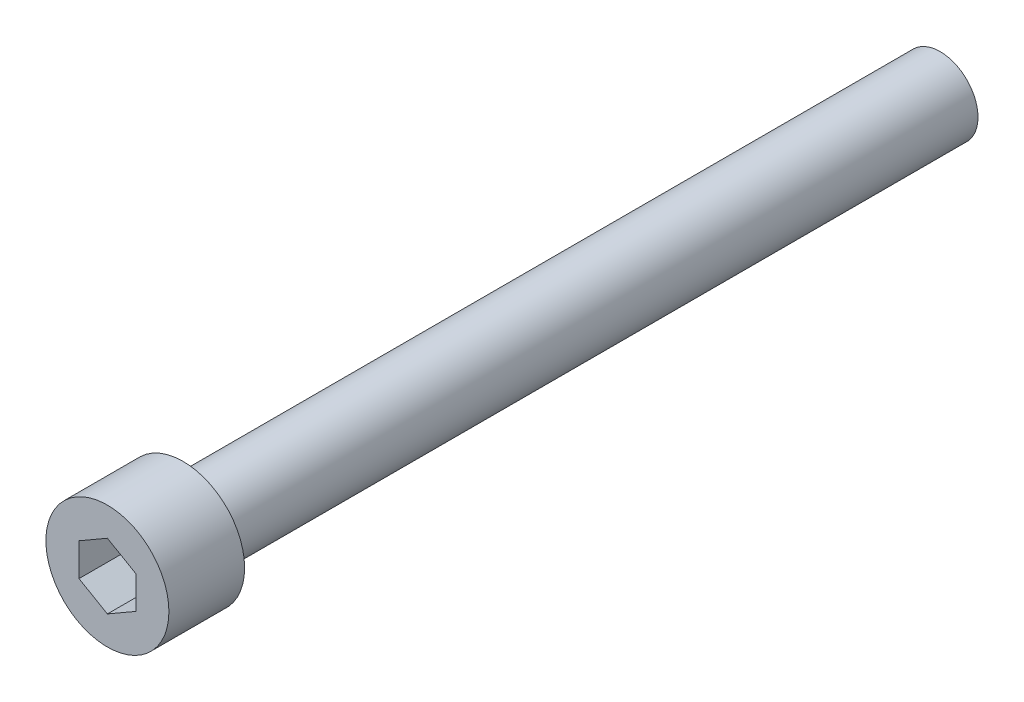
ISO-10303-21;
HEADER;
FILE_DESCRIPTION(('STEP AP214'),'2;1');
FILE_NAME('part.step','',(''),(''),'','','');
FILE_SCHEMA(('AUTOMOTIVE_DESIGN { 1 0 10303 214 1 1 1 1 }'));
ENDSEC;
DATA;
#1=APPLICATION_CONTEXT('core data for automotive mechanical design processes');
#2=APPLICATION_PROTOCOL_DEFINITION('international standard','automotive_design',2000,#1);
#3=PRODUCT_CONTEXT('',#1,'mechanical');
#4=PRODUCT('Part','Part','',(#3));
#5=PRODUCT_RELATED_PRODUCT_CATEGORY('part','',(#4));
#6=PRODUCT_DEFINITION_FORMATION('','',#4);
#7=PRODUCT_DEFINITION_CONTEXT('part definition',#1,'design');
#8=PRODUCT_DEFINITION('design','',#6,#7);
#9=PRODUCT_DEFINITION_SHAPE('','',#8);
#10=(LENGTH_UNIT() NAMED_UNIT(*) SI_UNIT(.MILLI.,.METRE.));
#11=(NAMED_UNIT(*) PLANE_ANGLE_UNIT() SI_UNIT($,.RADIAN.));
#12=(NAMED_UNIT(*) SI_UNIT($,.STERADIAN.) SOLID_ANGLE_UNIT());
#13=UNCERTAINTY_MEASURE_WITH_UNIT(LENGTH_MEASURE(1.E-05),#10,'distance_accuracy_value','');
#14=(GEOMETRIC_REPRESENTATION_CONTEXT(3) GLOBAL_UNCERTAINTY_ASSIGNED_CONTEXT((#13)) GLOBAL_UNIT_ASSIGNED_CONTEXT((#10,
#11,#12)) REPRESENTATION_CONTEXT('',''));
#15=CARTESIAN_POINT('',(0.,0.,0.));
#16=DIRECTION('',(0.,0.,1.));
#17=DIRECTION('',(1.,0.,0.));
#18=AXIS2_PLACEMENT_3D('',#15,#16,#17);
#19=CARTESIAN_POINT('',(0.,0.,0.));
#20=DIRECTION('',(0.,0.,-1.));
#21=DIRECTION('',(-1.,0.,0.));
#22=AXIS2_PLACEMENT_3D('',#19,#20,#21);
#23=PLANE('',#22);
#24=DIRECTION('',(0.866025403784439,-0.5,0.));
#25=VECTOR('',#24,1.);
#26=CARTESIAN_POINT('',(-3.,-1.73205080756888,0.));
#27=LINE('',#26,#25);
#28=CARTESIAN_POINT('',(-3.,-1.73205080756888,0.));
#29=VERTEX_POINT('',#28);
#30=CARTESIAN_POINT('',(0.,-3.46410161513776,0.));
#31=VERTEX_POINT('',#30);
#32=EDGE_CURVE('E123',#29,#31,#27,.T.);
#33=ORIENTED_EDGE('',*,*,#32,.F.);
#34=DIRECTION('',(0.,-1.,0.));
#35=VECTOR('',#34,1.);
#36=CARTESIAN_POINT('',(-3.,1.73205080756888,0.));
#37=LINE('',#36,#35);
#38=CARTESIAN_POINT('',(-3.,1.73205080756888,0.));
#39=VERTEX_POINT('',#38);
#40=EDGE_CURVE('E49',#39,#29,#37,.T.);
#41=ORIENTED_EDGE('',*,*,#40,.F.);
#42=DIRECTION('',(-0.866025403784439,-0.5,0.));
#43=VECTOR('',#42,1.);
#44=CARTESIAN_POINT('',(0.,3.46410161513776,0.));
#45=LINE('',#44,#43);
#46=CARTESIAN_POINT('',(0.,3.46410161513776,0.));
#47=VERTEX_POINT('',#46);
#48=EDGE_CURVE('E132',#47,#39,#45,.T.);
#49=ORIENTED_EDGE('',*,*,#48,.F.);
#50=DIRECTION('',(-0.866025403784439,0.5,0.));
#51=VECTOR('',#50,1.);
#52=CARTESIAN_POINT('',(3.,1.73205080756888,0.));
#53=LINE('',#52,#51);
#54=CARTESIAN_POINT('',(3.,1.73205080756888,0.));
#55=VERTEX_POINT('',#54);
#56=EDGE_CURVE('E130',#55,#47,#53,.T.);
#57=ORIENTED_EDGE('',*,*,#56,.F.);
#58=DIRECTION('',(0.,1.,0.));
#59=VECTOR('',#58,1.);
#60=CARTESIAN_POINT('',(3.,-1.73205080756888,0.));
#61=LINE('',#60,#59);
#62=CARTESIAN_POINT('',(3.,-1.73205080756888,0.));
#63=VERTEX_POINT('',#62);
#64=EDGE_CURVE('E97',#63,#55,#61,.T.);
#65=ORIENTED_EDGE('',*,*,#64,.F.);
#66=DIRECTION('',(0.866025403784439,0.5,0.));
#67=VECTOR('',#66,1.);
#68=CARTESIAN_POINT('',(0.,-3.46410161513776,0.));
#69=LINE('',#68,#67);
#70=EDGE_CURVE('E126',#31,#63,#69,.T.);
#71=ORIENTED_EDGE('',*,*,#70,.F.);
#72=EDGE_LOOP('',(#33,#41,#49,#57,#65,#71));
#73=FACE_BOUND('',#72,.T.);
#74=CARTESIAN_POINT('',(0.,0.,0.));
#75=DIRECTION('',(0.,0.,1.));
#76=DIRECTION('',(1.,0.,0.));
#77=AXIS2_PLACEMENT_3D('',#74,#75,#76);
#78=CIRCLE('',#77,6.5);
#79=CARTESIAN_POINT('',(6.5,0.,0.));
#80=VERTEX_POINT('',#79);
#81=EDGE_CURVE('E11',#80,#80,#78,.T.);
#82=ORIENTED_EDGE('',*,*,#81,.T.);
#83=EDGE_LOOP('',(#82));
#84=FACE_BOUND('',#83,.T.);
#85=ADVANCED_FACE('F35',(#73,#84),#23,.F.);
#86=CARTESIAN_POINT('',(0.,0.,0.));
#87=DIRECTION('',(0.,0.,1.));
#88=DIRECTION('',(1.,0.,0.));
#89=AXIS2_PLACEMENT_3D('',#86,#87,#88);
#90=CYLINDRICAL_SURFACE('',#89,6.5);
#91=ORIENTED_EDGE('',*,*,#81,.F.);
#92=EDGE_LOOP('',(#91));
#93=FACE_BOUND('',#92,.T.);
#94=CARTESIAN_POINT('',(0.,0.,-8.));
#95=DIRECTION('',(0.,0.,1.));
#96=DIRECTION('',(1.,0.,0.));
#97=AXIS2_PLACEMENT_3D('',#94,#95,#96);
#98=CIRCLE('',#97,6.5);
#99=CARTESIAN_POINT('',(6.5,0.,-8.));
#100=VERTEX_POINT('',#99);
#101=EDGE_CURVE('E42',#100,#100,#98,.T.);
#102=ORIENTED_EDGE('',*,*,#101,.T.);
#103=EDGE_LOOP('',(#102));
#104=FACE_BOUND('',#103,.T.);
#105=ADVANCED_FACE('F149',(#93,#104),#90,.T.);
#106=CARTESIAN_POINT('',(0.,6.5,-8.));
#107=DIRECTION('',(0.,0.,1.));
#108=DIRECTION('',(1.,0.,0.));
#109=AXIS2_PLACEMENT_3D('',#106,#107,#108);
#110=PLANE('',#109);
#111=ORIENTED_EDGE('',*,*,#101,.F.);
#112=EDGE_LOOP('',(#111));
#113=FACE_BOUND('',#112,.T.);
#114=CARTESIAN_POINT('',(0.,0.,-8.));
#115=DIRECTION('',(0.,0.,1.));
#116=DIRECTION('',(1.,0.,0.));
#117=AXIS2_PLACEMENT_3D('',#114,#115,#116);
#118=CIRCLE('',#117,4.);
#119=CARTESIAN_POINT('',(4.,0.,-8.));
#120=VERTEX_POINT('',#119);
#121=EDGE_CURVE('E144',#120,#120,#118,.T.);
#122=ORIENTED_EDGE('',*,*,#121,.T.);
#123=EDGE_LOOP('',(#122));
#124=FACE_BOUND('',#123,.T.);
#125=ADVANCED_FACE('F151',(#113,#124),#110,.F.);
#126=CARTESIAN_POINT('',(0.,0.,0.));
#127=DIRECTION('',(0.,0.,1.));
#128=DIRECTION('',(1.,0.,0.));
#129=AXIS2_PLACEMENT_3D('',#126,#127,#128);
#130=CYLINDRICAL_SURFACE('',#129,4.);
#131=ORIENTED_EDGE('',*,*,#121,.F.);
#132=EDGE_LOOP('',(#131));
#133=FACE_BOUND('',#132,.T.);
#134=CARTESIAN_POINT('',(0.,0.,-88.));
#135=DIRECTION('',(0.,0.,1.));
#136=DIRECTION('',(1.,0.,0.));
#137=AXIS2_PLACEMENT_3D('',#134,#135,#136);
#138=CIRCLE('',#137,4.);
#139=CARTESIAN_POINT('',(4.,0.,-88.));
#140=VERTEX_POINT('',#139);
#141=EDGE_CURVE('E136',#140,#140,#138,.T.);
#142=ORIENTED_EDGE('',*,*,#141,.T.);
#143=EDGE_LOOP('',(#142));
#144=FACE_BOUND('',#143,.T.);
#145=ADVANCED_FACE('F154',(#133,#144),#130,.T.);
#146=CARTESIAN_POINT('',(0.,4.,-88.));
#147=DIRECTION('',(0.,0.,1.));
#148=DIRECTION('',(1.,0.,0.));
#149=AXIS2_PLACEMENT_3D('',#146,#147,#148);
#150=PLANE('',#149);
#151=ORIENTED_EDGE('',*,*,#141,.F.);
#152=EDGE_LOOP('',(#151));
#153=FACE_BOUND('',#152,.T.);
#154=ADVANCED_FACE('F160',(#153),#150,.F.);
#155=CARTESIAN_POINT('',(-3.,1.73205080756888,-6.));
#156=DIRECTION('',(-1.,0.,0.));
#157=DIRECTION('',(0.,0.,1.));
#158=AXIS2_PLACEMENT_3D('',#155,#156,#157);
#159=PLANE('',#158);
#160=ORIENTED_EDGE('',*,*,#40,.T.);
#161=DIRECTION('',(0.,0.,1.));
#162=VECTOR('',#161,1.);
#163=CARTESIAN_POINT('',(-3.,-1.73205080756888,-6.));
#164=LINE('',#163,#162);
#165=CARTESIAN_POINT('',(-3.,-1.73205080756888,-6.));
#166=VERTEX_POINT('',#165);
#167=EDGE_CURVE('E79',#166,#29,#164,.T.);
#168=ORIENTED_EDGE('',*,*,#167,.F.);
#169=DIRECTION('',(0.,-1.,0.));
#170=VECTOR('',#169,1.);
#171=CARTESIAN_POINT('',(-3.,1.73205080756888,-6.));
#172=LINE('',#171,#170);
#173=CARTESIAN_POINT('',(-3.,1.73205080756888,-6.));
#174=VERTEX_POINT('',#173);
#175=EDGE_CURVE('E134',#174,#166,#172,.T.);
#176=ORIENTED_EDGE('',*,*,#175,.F.);
#177=DIRECTION('',(0.,0.,1.));
#178=VECTOR('',#177,1.);
#179=CARTESIAN_POINT('',(-3.,1.73205080756888,-6.));
#180=LINE('',#179,#178);
#181=EDGE_CURVE('E57',#174,#39,#180,.T.);
#182=ORIENTED_EDGE('',*,*,#181,.T.);
#183=EDGE_LOOP('',(#160,#168,#176,#182));
#184=FACE_BOUND('',#183,.T.);
#185=ADVANCED_FACE('F165',(#184),#159,.F.);
#186=CARTESIAN_POINT('',(0.,3.46410161513776,-6.));
#187=DIRECTION('',(-0.5,0.866025403784439,0.));
#188=DIRECTION('',(-0.866025403784439,-0.5,0.));
#189=AXIS2_PLACEMENT_3D('',#186,#187,#188);
#190=PLANE('',#189);
#191=ORIENTED_EDGE('',*,*,#48,.T.);
#192=ORIENTED_EDGE('',*,*,#181,.F.);
#193=DIRECTION('',(-0.866025403784439,-0.5,0.));
#194=VECTOR('',#193,1.);
#195=CARTESIAN_POINT('',(0.,3.46410161513776,-6.));
#196=LINE('',#195,#194);
#197=CARTESIAN_POINT('',(0.,3.46410161513776,-6.));
#198=VERTEX_POINT('',#197);
#199=EDGE_CURVE('E109',#198,#174,#196,.T.);
#200=ORIENTED_EDGE('',*,*,#199,.F.);
#201=DIRECTION('',(0.,0.,1.));
#202=VECTOR('',#201,1.);
#203=CARTESIAN_POINT('',(0.,3.46410161513776,-6.));
#204=LINE('',#203,#202);
#205=EDGE_CURVE('E101',#198,#47,#204,.T.);
#206=ORIENTED_EDGE('',*,*,#205,.T.);
#207=EDGE_LOOP('',(#191,#192,#200,#206));
#208=FACE_BOUND('',#207,.T.);
#209=ADVANCED_FACE('F170',(#208),#190,.F.);
#210=CARTESIAN_POINT('',(3.,1.73205080756888,-6.));
#211=DIRECTION('',(0.5,0.866025403784439,0.));
#212=DIRECTION('',(-0.866025403784439,0.5,0.));
#213=AXIS2_PLACEMENT_3D('',#210,#211,#212);
#214=PLANE('',#213);
#215=ORIENTED_EDGE('',*,*,#56,.T.);
#216=ORIENTED_EDGE('',*,*,#205,.F.);
#217=DIRECTION('',(-0.866025403784439,0.5,0.));
#218=VECTOR('',#217,1.);
#219=CARTESIAN_POINT('',(3.,1.73205080756888,-6.));
#220=LINE('',#219,#218);
#221=CARTESIAN_POINT('',(3.,1.73205080756888,-6.));
#222=VERTEX_POINT('',#221);
#223=EDGE_CURVE('E105',#222,#198,#220,.T.);
#224=ORIENTED_EDGE('',*,*,#223,.F.);
#225=DIRECTION('',(0.,0.,1.));
#226=VECTOR('',#225,1.);
#227=CARTESIAN_POINT('',(3.,1.73205080756888,-6.));
#228=LINE('',#227,#226);
#229=EDGE_CURVE('E90',#222,#55,#228,.T.);
#230=ORIENTED_EDGE('',*,*,#229,.T.);
#231=EDGE_LOOP('',(#215,#216,#224,#230));
#232=FACE_BOUND('',#231,.T.);
#233=ADVANCED_FACE('F106',(#232),#214,.F.);
#234=CARTESIAN_POINT('',(3.,-1.73205080756888,-6.));
#235=DIRECTION('',(1.,0.,0.));
#236=DIRECTION('',(0.,1.,0.));
#237=AXIS2_PLACEMENT_3D('',#234,#235,#236);
#238=PLANE('',#237);
#239=ORIENTED_EDGE('',*,*,#64,.T.);
#240=ORIENTED_EDGE('',*,*,#229,.F.);
#241=DIRECTION('',(0.,1.,0.));
#242=VECTOR('',#241,1.);
#243=CARTESIAN_POINT('',(3.,-1.73205080756888,-6.));
#244=LINE('',#243,#242);
#245=CARTESIAN_POINT('',(3.,-1.73205080756888,-6.));
#246=VERTEX_POINT('',#245);
#247=EDGE_CURVE('E94',#246,#222,#244,.T.);
#248=ORIENTED_EDGE('',*,*,#247,.F.);
#249=DIRECTION('',(0.,0.,1.));
#250=VECTOR('',#249,1.);
#251=CARTESIAN_POINT('',(3.,-1.73205080756888,-6.));
#252=LINE('',#251,#250);
#253=EDGE_CURVE('E102',#246,#63,#252,.T.);
#254=ORIENTED_EDGE('',*,*,#253,.T.);
#255=EDGE_LOOP('',(#239,#240,#248,#254));
#256=FACE_BOUND('',#255,.T.);
#257=ADVANCED_FACE('F92',(#256),#238,.F.);
#258=CARTESIAN_POINT('',(0.,-3.46410161513776,-6.));
#259=DIRECTION('',(0.5,-0.866025403784438,0.));
#260=DIRECTION('',(0.866025403784439,0.5,0.));
#261=AXIS2_PLACEMENT_3D('',#258,#259,#260);
#262=PLANE('',#261);
#263=ORIENTED_EDGE('',*,*,#70,.T.);
#264=ORIENTED_EDGE('',*,*,#253,.F.);
#265=DIRECTION('',(0.866025403784439,0.5,0.));
#266=VECTOR('',#265,1.);
#267=CARTESIAN_POINT('',(0.,-3.46410161513776,-6.));
#268=LINE('',#267,#266);
#269=CARTESIAN_POINT('',(0.,-3.46410161513776,-6.));
#270=VERTEX_POINT('',#269);
#271=EDGE_CURVE('E115',#270,#246,#268,.T.);
#272=ORIENTED_EDGE('',*,*,#271,.F.);
#273=DIRECTION('',(0.,0.,1.));
#274=VECTOR('',#273,1.);
#275=CARTESIAN_POINT('',(0.,-3.46410161513776,-6.));
#276=LINE('',#275,#274);
#277=EDGE_CURVE('E139',#270,#31,#276,.T.);
#278=ORIENTED_EDGE('',*,*,#277,.T.);
#279=EDGE_LOOP('',(#263,#264,#272,#278));
#280=FACE_BOUND('',#279,.T.);
#281=ADVANCED_FACE('F196',(#280),#262,.F.);
#282=CARTESIAN_POINT('',(-3.,-1.73205080756888,-6.));
#283=DIRECTION('',(-0.5,-0.866025403784438,0.));
#284=DIRECTION('',(0.866025403784439,-0.5,0.));
#285=AXIS2_PLACEMENT_3D('',#282,#283,#284);
#286=PLANE('',#285);
#287=ORIENTED_EDGE('',*,*,#32,.T.);
#288=ORIENTED_EDGE('',*,*,#277,.F.);
#289=DIRECTION('',(0.866025403784439,-0.5,0.));
#290=VECTOR('',#289,1.);
#291=CARTESIAN_POINT('',(-3.,-1.73205080756888,-6.));
#292=LINE('',#291,#290);
#293=EDGE_CURVE('E117',#166,#270,#292,.T.);
#294=ORIENTED_EDGE('',*,*,#293,.F.);
#295=ORIENTED_EDGE('',*,*,#167,.T.);
#296=EDGE_LOOP('',(#287,#288,#294,#295));
#297=FACE_BOUND('',#296,.T.);
#298=ADVANCED_FACE('F184',(#297),#286,.F.);
#299=CARTESIAN_POINT('',(0.,0.,-6.));
#300=DIRECTION('',(0.,0.,1.));
#301=DIRECTION('',(1.,0.,0.));
#302=AXIS2_PLACEMENT_3D('',#299,#300,#301);
#303=PLANE('',#302);
#304=ORIENTED_EDGE('',*,*,#175,.T.);
#305=ORIENTED_EDGE('',*,*,#293,.T.);
#306=ORIENTED_EDGE('',*,*,#271,.T.);
#307=ORIENTED_EDGE('',*,*,#247,.T.);
#308=ORIENTED_EDGE('',*,*,#223,.T.);
#309=ORIENTED_EDGE('',*,*,#199,.T.);
#310=EDGE_LOOP('',(#304,#305,#306,#307,#308,#309));
#311=FACE_BOUND('',#310,.T.);
#312=ADVANCED_FACE('F112',(#311),#303,.T.);
#313=CLOSED_SHELL('',(#85,#105,#125,#145,#154,#185,#209,#233,#257,#281,#298,#312));
#314=MANIFOLD_SOLID_BREP('B2',#313);
#315=ADVANCED_BREP_SHAPE_REPRESENTATION('',(#18,#314),#14);
#316=SHAPE_DEFINITION_REPRESENTATION(#9,#315);
ENDSEC;
END-ISO-10303-21;
